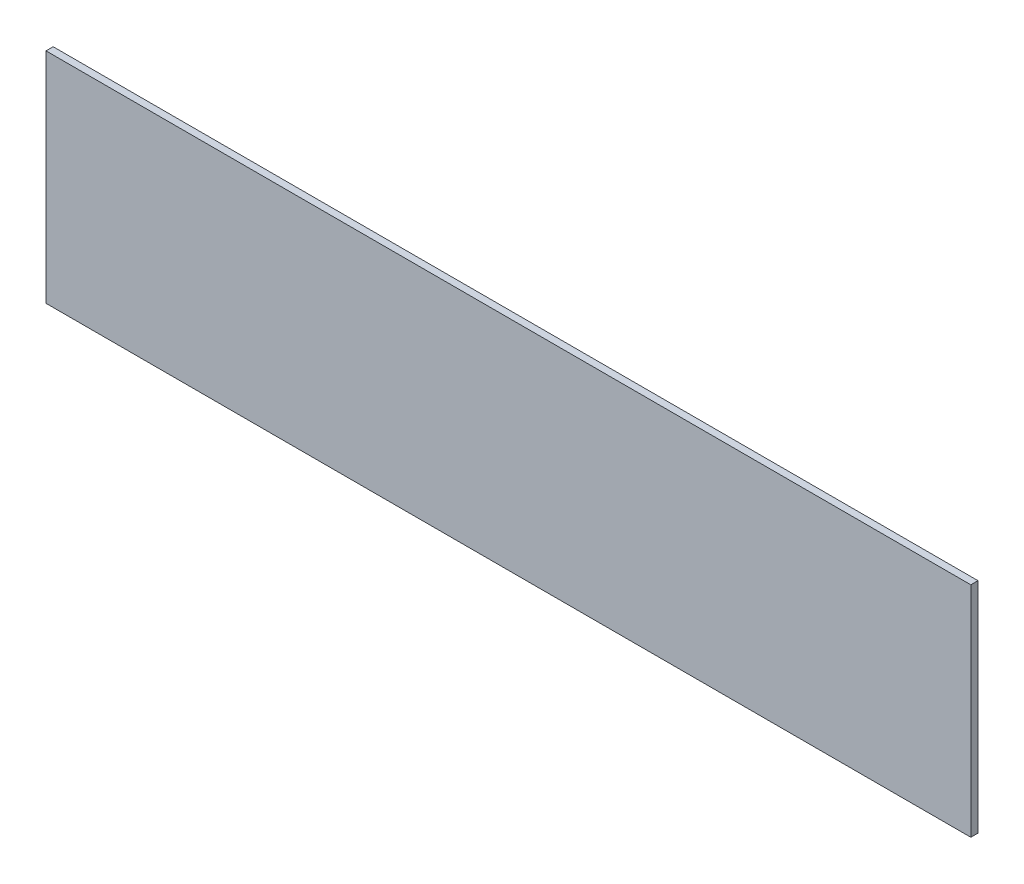
ISO-10303-21;
HEADER;
FILE_DESCRIPTION(('STEP AP214'),'2;1');
FILE_NAME('part.step','',(''),(''),'','','');
FILE_SCHEMA(('AUTOMOTIVE_DESIGN { 1 0 10303 214 1 1 1 1 }'));
ENDSEC;
DATA;
#1=APPLICATION_CONTEXT('core data for automotive mechanical design processes');
#2=APPLICATION_PROTOCOL_DEFINITION('international standard','automotive_design',2000,#1);
#3=PRODUCT_CONTEXT('',#1,'mechanical');
#4=PRODUCT('Part','Part','',(#3));
#5=PRODUCT_RELATED_PRODUCT_CATEGORY('part','',(#4));
#6=PRODUCT_DEFINITION_FORMATION('','',#4);
#7=PRODUCT_DEFINITION_CONTEXT('part definition',#1,'design');
#8=PRODUCT_DEFINITION('design','',#6,#7);
#9=PRODUCT_DEFINITION_SHAPE('','',#8);
#10=(LENGTH_UNIT() NAMED_UNIT(*) SI_UNIT(.MILLI.,.METRE.));
#11=(NAMED_UNIT(*) PLANE_ANGLE_UNIT() SI_UNIT($,.RADIAN.));
#12=(NAMED_UNIT(*) SI_UNIT($,.STERADIAN.) SOLID_ANGLE_UNIT());
#13=UNCERTAINTY_MEASURE_WITH_UNIT(LENGTH_MEASURE(1.E-05),#10,'distance_accuracy_value','');
#14=(GEOMETRIC_REPRESENTATION_CONTEXT(3) GLOBAL_UNCERTAINTY_ASSIGNED_CONTEXT((#13)) GLOBAL_UNIT_ASSIGNED_CONTEXT((#10,
#11,#12)) REPRESENTATION_CONTEXT('',''));
#15=CARTESIAN_POINT('',(0.,0.,0.));
#16=DIRECTION('',(0.,0.,1.));
#17=DIRECTION('',(1.,0.,0.));
#18=AXIS2_PLACEMENT_3D('',#15,#16,#17);
#19=CARTESIAN_POINT('',(258.,-61.,4.));
#20=DIRECTION('',(-1.,0.,0.));
#21=DIRECTION('',(0.,0.,1.));
#22=AXIS2_PLACEMENT_3D('',#19,#20,#21);
#23=PLANE('',#22);
#24=DIRECTION('',(0.,1.,0.));
#25=VECTOR('',#24,1.);
#26=CARTESIAN_POINT('',(258.,-61.,0.));
#27=LINE('',#26,#25);
#28=CARTESIAN_POINT('',(258.,-61.,0.));
#29=VERTEX_POINT('',#28);
#30=CARTESIAN_POINT('',(258.,61.,0.));
#31=VERTEX_POINT('',#30);
#32=EDGE_CURVE('E99',#29,#31,#27,.T.);
#33=ORIENTED_EDGE('',*,*,#32,.T.);
#34=DIRECTION('',(0.,0.,-1.));
#35=VECTOR('',#34,1.);
#36=CARTESIAN_POINT('',(258.,61.,4.));
#37=LINE('',#36,#35);
#38=CARTESIAN_POINT('',(258.,61.,4.));
#39=VERTEX_POINT('',#38);
#40=EDGE_CURVE('E11',#39,#31,#37,.T.);
#41=ORIENTED_EDGE('',*,*,#40,.F.);
#42=DIRECTION('',(0.,1.,0.));
#43=VECTOR('',#42,1.);
#44=CARTESIAN_POINT('',(258.,-61.,4.));
#45=LINE('',#44,#43);
#46=CARTESIAN_POINT('',(258.,-61.,4.));
#47=VERTEX_POINT('',#46);
#48=EDGE_CURVE('E85',#47,#39,#45,.T.);
#49=ORIENTED_EDGE('',*,*,#48,.F.);
#50=DIRECTION('',(0.,0.,-1.));
#51=VECTOR('',#50,1.);
#52=CARTESIAN_POINT('',(258.,-61.,4.));
#53=LINE('',#52,#51);
#54=EDGE_CURVE('E95',#47,#29,#53,.T.);
#55=ORIENTED_EDGE('',*,*,#54,.T.);
#56=EDGE_LOOP('',(#33,#41,#49,#55));
#57=FACE_BOUND('',#56,.T.);
#58=ADVANCED_FACE('F35',(#57),#23,.F.);
#59=CARTESIAN_POINT('',(-258.,61.,4.));
#60=DIRECTION('',(0.,-1.,0.));
#61=DIRECTION('',(0.,0.,-1.));
#62=AXIS2_PLACEMENT_3D('',#59,#60,#61);
#63=PLANE('',#62);
#64=DIRECTION('',(-1.,0.,0.));
#65=VECTOR('',#64,1.);
#66=CARTESIAN_POINT('',(-258.,61.,0.));
#67=LINE('',#66,#65);
#68=CARTESIAN_POINT('',(-258.,61.,0.));
#69=VERTEX_POINT('',#68);
#70=EDGE_CURVE('E90',#31,#69,#67,.T.);
#71=ORIENTED_EDGE('',*,*,#70,.T.);
#72=DIRECTION('',(0.,0.,-1.));
#73=VECTOR('',#72,1.);
#74=CARTESIAN_POINT('',(-258.,61.,4.));
#75=LINE('',#74,#73);
#76=CARTESIAN_POINT('',(-258.,61.,4.));
#77=VERTEX_POINT('',#76);
#78=EDGE_CURVE('E43',#77,#69,#75,.T.);
#79=ORIENTED_EDGE('',*,*,#78,.F.);
#80=DIRECTION('',(-1.,0.,0.));
#81=VECTOR('',#80,1.);
#82=CARTESIAN_POINT('',(-258.,61.,4.));
#83=LINE('',#82,#81);
#84=EDGE_CURVE('E79',#39,#77,#83,.T.);
#85=ORIENTED_EDGE('',*,*,#84,.F.);
#86=ORIENTED_EDGE('',*,*,#40,.T.);
#87=EDGE_LOOP('',(#71,#79,#85,#86));
#88=FACE_BOUND('',#87,.T.);
#89=ADVANCED_FACE('F89',(#88),#63,.F.);
#90=CARTESIAN_POINT('',(-258.,-61.,4.));
#91=DIRECTION('',(1.,0.,0.));
#92=DIRECTION('',(0.,0.,-1.));
#93=AXIS2_PLACEMENT_3D('',#90,#91,#92);
#94=PLANE('',#93);
#95=DIRECTION('',(0.,-1.,0.));
#96=VECTOR('',#95,1.);
#97=CARTESIAN_POINT('',(-258.,-61.,0.));
#98=LINE('',#97,#96);
#99=CARTESIAN_POINT('',(-258.,-61.,0.));
#100=VERTEX_POINT('',#99);
#101=EDGE_CURVE('E103',#69,#100,#98,.T.);
#102=ORIENTED_EDGE('',*,*,#101,.T.);
#103=DIRECTION('',(0.,0.,-1.));
#104=VECTOR('',#103,1.);
#105=CARTESIAN_POINT('',(-258.,-61.,4.));
#106=LINE('',#105,#104);
#107=CARTESIAN_POINT('',(-258.,-61.,4.));
#108=VERTEX_POINT('',#107);
#109=EDGE_CURVE('E92',#108,#100,#106,.T.);
#110=ORIENTED_EDGE('',*,*,#109,.F.);
#111=DIRECTION('',(0.,-1.,0.));
#112=VECTOR('',#111,1.);
#113=CARTESIAN_POINT('',(-258.,-61.,4.));
#114=LINE('',#113,#112);
#115=EDGE_CURVE('E82',#77,#108,#114,.T.);
#116=ORIENTED_EDGE('',*,*,#115,.F.);
#117=ORIENTED_EDGE('',*,*,#78,.T.);
#118=EDGE_LOOP('',(#102,#110,#116,#117));
#119=FACE_BOUND('',#118,.T.);
#120=ADVANCED_FACE('F93',(#119),#94,.F.);
#121=CARTESIAN_POINT('',(185.485837703549,-61.,4.));
#122=DIRECTION('',(0.,1.,0.));
#123=DIRECTION('',(0.,0.,1.));
#124=AXIS2_PLACEMENT_3D('',#121,#122,#123);
#125=PLANE('',#124);
#126=DIRECTION('',(1.,0.,0.));
#127=VECTOR('',#126,1.);
#128=CARTESIAN_POINT('',(185.485837703549,-61.,0.));
#129=LINE('',#128,#127);
#130=EDGE_CURVE('E68',#100,#29,#129,.T.);
#131=ORIENTED_EDGE('',*,*,#130,.T.);
#132=ORIENTED_EDGE('',*,*,#54,.F.);
#133=DIRECTION('',(1.,0.,0.));
#134=VECTOR('',#133,1.);
#135=CARTESIAN_POINT('',(-258.,-61.,4.));
#136=LINE('',#135,#134);
#137=EDGE_CURVE('E51',#108,#47,#136,.T.);
#138=ORIENTED_EDGE('',*,*,#137,.F.);
#139=ORIENTED_EDGE('',*,*,#109,.T.);
#140=EDGE_LOOP('',(#131,#132,#138,#139));
#141=FACE_BOUND('',#140,.T.);
#142=ADVANCED_FACE('F107',(#141),#125,.F.);
#143=CARTESIAN_POINT('',(0.,0.,4.));
#144=DIRECTION('',(0.,0.,-1.));
#145=DIRECTION('',(-1.,0.,0.));
#146=AXIS2_PLACEMENT_3D('',#143,#144,#145);
#147=PLANE('',#146);
#148=ORIENTED_EDGE('',*,*,#48,.T.);
#149=ORIENTED_EDGE('',*,*,#84,.T.);
#150=ORIENTED_EDGE('',*,*,#115,.T.);
#151=ORIENTED_EDGE('',*,*,#137,.T.);
#152=EDGE_LOOP('',(#148,#149,#150,#151));
#153=FACE_BOUND('',#152,.T.);
#154=ADVANCED_FACE('F80',(#153),#147,.F.);
#155=CARTESIAN_POINT('',(0.,0.,0.));
#156=DIRECTION('',(0.,0.,-1.));
#157=DIRECTION('',(-1.,0.,0.));
#158=AXIS2_PLACEMENT_3D('',#155,#156,#157);
#159=PLANE('',#158);
#160=ORIENTED_EDGE('',*,*,#32,.F.);
#161=ORIENTED_EDGE('',*,*,#130,.F.);
#162=ORIENTED_EDGE('',*,*,#101,.F.);
#163=ORIENTED_EDGE('',*,*,#70,.F.);
#164=EDGE_LOOP('',(#160,#161,#162,#163));
#165=FACE_BOUND('',#164,.T.);
#166=ADVANCED_FACE('F109',(#165),#159,.T.);
#167=CLOSED_SHELL('',(#58,#89,#120,#142,#154,#166));
#168=MANIFOLD_SOLID_BREP('B2',#167);
#169=ADVANCED_BREP_SHAPE_REPRESENTATION('',(#18,#168),#14);
#170=SHAPE_DEFINITION_REPRESENTATION(#9,#169);
ENDSEC;
END-ISO-10303-21;
